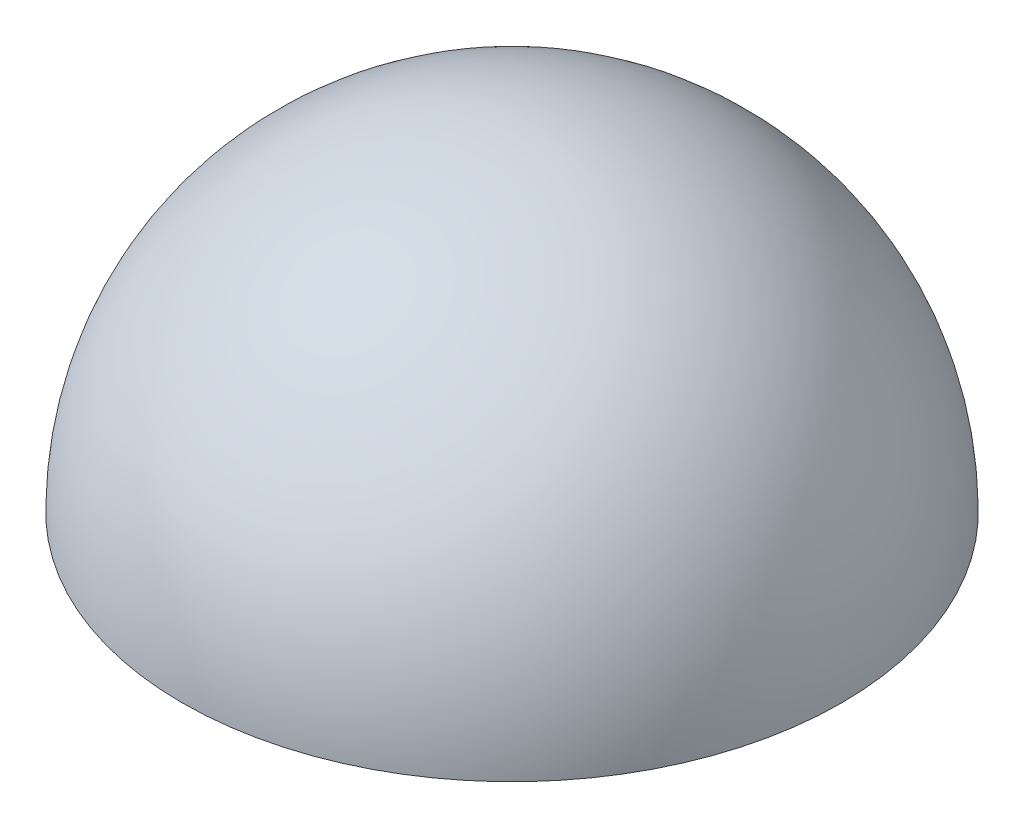
ISO-10303-21;
HEADER;
FILE_DESCRIPTION(('STEP AP214'),'2;1');
FILE_NAME('part.step','',(''),(''),'','','');
FILE_SCHEMA(('AUTOMOTIVE_DESIGN { 1 0 10303 214 1 1 1 1 }'));
ENDSEC;
DATA;
#1=APPLICATION_CONTEXT('core data for automotive mechanical design processes');
#2=APPLICATION_PROTOCOL_DEFINITION('international standard','automotive_design',2000,#1);
#3=PRODUCT_CONTEXT('',#1,'mechanical');
#4=PRODUCT('Part','Part','',(#3));
#5=PRODUCT_RELATED_PRODUCT_CATEGORY('part','',(#4));
#6=PRODUCT_DEFINITION_FORMATION('','',#4);
#7=PRODUCT_DEFINITION_CONTEXT('part definition',#1,'design');
#8=PRODUCT_DEFINITION('design','',#6,#7);
#9=PRODUCT_DEFINITION_SHAPE('','',#8);
#10=(LENGTH_UNIT() NAMED_UNIT(*) SI_UNIT(.MILLI.,.METRE.));
#11=(NAMED_UNIT(*) PLANE_ANGLE_UNIT() SI_UNIT($,.RADIAN.));
#12=(NAMED_UNIT(*) SI_UNIT($,.STERADIAN.) SOLID_ANGLE_UNIT());
#13=UNCERTAINTY_MEASURE_WITH_UNIT(LENGTH_MEASURE(1.E-05),#10,'distance_accuracy_value','');
#14=(GEOMETRIC_REPRESENTATION_CONTEXT(3) GLOBAL_UNCERTAINTY_ASSIGNED_CONTEXT((#13)) GLOBAL_UNIT_ASSIGNED_CONTEXT((#10,
#11,#12)) REPRESENTATION_CONTEXT('',''));
#15=CARTESIAN_POINT('',(0.,0.,0.));
#16=DIRECTION('',(0.,0.,1.));
#17=DIRECTION('',(1.,0.,0.));
#18=AXIS2_PLACEMENT_3D('',#15,#16,#17);
#19=CARTESIAN_POINT('',(0.,0.,0.));
#20=DIRECTION('',(0.,1.,0.));
#21=DIRECTION('',(-1.,0.,0.));
#22=AXIS2_PLACEMENT_3D('',#19,#20,#21);
#23=SPHERICAL_SURFACE('',#22,294.386);
#24=CARTESIAN_POINT('',(0.,0.,0.));
#25=DIRECTION('',(0.,1.,0.));
#26=DIRECTION('',(0.,0.,1.));
#27=AXIS2_PLACEMENT_3D('',#24,#25,#26);
#28=CIRCLE('',#27,294.386);
#29=CARTESIAN_POINT('',(0.,0.,294.386));
#30=VERTEX_POINT('',#29);
#31=EDGE_CURVE('E41',#30,#30,#28,.T.);
#32=ORIENTED_EDGE('',*,*,#31,.F.);
#33=EDGE_LOOP('',(#32));
#34=FACE_BOUND('',#33,.T.);
#35=ADVANCED_FACE('F35',(#34),#23,.F.);
#36=CARTESIAN_POINT('',(0.,0.,0.));
#37=DIRECTION('',(0.,1.,0.));
#38=DIRECTION('',(1.,0.,0.));
#39=AXIS2_PLACEMENT_3D('',#36,#37,#38);
#40=SPHERICAL_SURFACE('',#39,298.45);
#41=CARTESIAN_POINT('',(0.,0.,0.));
#42=DIRECTION('',(0.,1.,0.));
#43=DIRECTION('',(0.,0.,1.));
#44=AXIS2_PLACEMENT_3D('',#41,#42,#43);
#45=CIRCLE('',#44,298.45);
#46=CARTESIAN_POINT('',(0.,0.,298.45));
#47=VERTEX_POINT('',#46);
#48=EDGE_CURVE('E10',#47,#47,#45,.T.);
#49=ORIENTED_EDGE('',*,*,#48,.T.);
#50=EDGE_LOOP('',(#49));
#51=FACE_BOUND('',#50,.T.);
#52=ADVANCED_FACE('F51',(#51),#40,.T.);
#53=CARTESIAN_POINT('',(-298.45,0.,0.));
#54=DIRECTION('',(0.,-1.,0.));
#55=DIRECTION('',(0.,0.,-1.));
#56=AXIS2_PLACEMENT_3D('',#53,#54,#55);
#57=PLANE('',#56);
#58=ORIENTED_EDGE('',*,*,#31,.T.);
#59=EDGE_LOOP('',(#58));
#60=FACE_BOUND('',#59,.T.);
#61=ORIENTED_EDGE('',*,*,#48,.F.);
#62=EDGE_LOOP('',(#61));
#63=FACE_BOUND('',#62,.T.);
#64=ADVANCED_FACE('F47',(#60,#63),#57,.T.);
#65=CLOSED_SHELL('',(#35,#52,#64));
#66=MANIFOLD_SOLID_BREP('B2',#65);
#67=ADVANCED_BREP_SHAPE_REPRESENTATION('',(#18,#66),#14);
#68=SHAPE_DEFINITION_REPRESENTATION(#9,#67);
ENDSEC;
END-ISO-10303-21;
